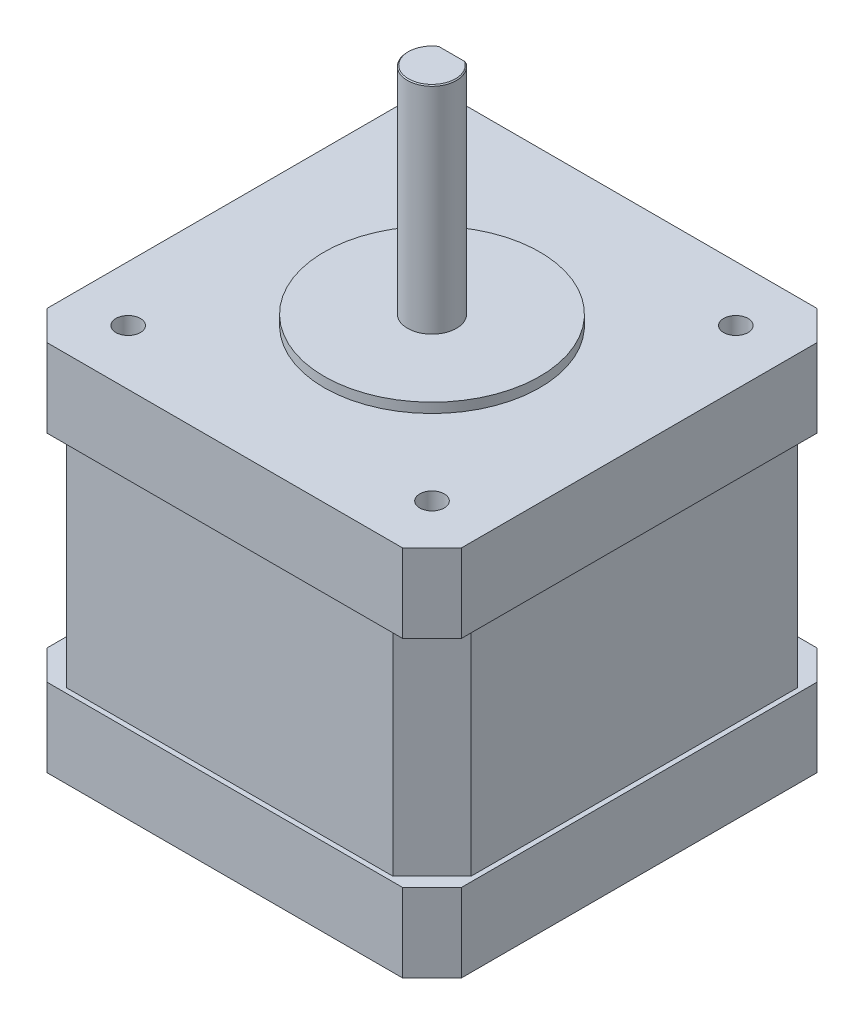
ISO-10303-21;
HEADER;
FILE_DESCRIPTION(('STEP AP214'),'2;1');
FILE_NAME('part.step','',(''),(''),'','','');
FILE_SCHEMA(('AUTOMOTIVE_DESIGN { 1 0 10303 214 1 1 1 1 }'));
ENDSEC;
DATA;
#1=APPLICATION_CONTEXT('core data for automotive mechanical design processes');
#2=APPLICATION_PROTOCOL_DEFINITION('international standard','automotive_design',2000,#1);
#3=PRODUCT_CONTEXT('',#1,'mechanical');
#4=PRODUCT('Part','Part','',(#3));
#5=PRODUCT_RELATED_PRODUCT_CATEGORY('part','',(#4));
#6=PRODUCT_DEFINITION_FORMATION('','',#4);
#7=PRODUCT_DEFINITION_CONTEXT('part definition',#1,'design');
#8=PRODUCT_DEFINITION('design','',#6,#7);
#9=PRODUCT_DEFINITION_SHAPE('','',#8);
#10=(LENGTH_UNIT() NAMED_UNIT(*) SI_UNIT(.MILLI.,.METRE.));
#11=(NAMED_UNIT(*) PLANE_ANGLE_UNIT() SI_UNIT($,.RADIAN.));
#12=(NAMED_UNIT(*) SI_UNIT($,.STERADIAN.) SOLID_ANGLE_UNIT());
#13=UNCERTAINTY_MEASURE_WITH_UNIT(LENGTH_MEASURE(1.E-05),#10,'distance_accuracy_value','');
#14=(GEOMETRIC_REPRESENTATION_CONTEXT(3) GLOBAL_UNCERTAINTY_ASSIGNED_CONTEXT((#13)) GLOBAL_UNIT_ASSIGNED_CONTEXT((#10,
#11,#12)) REPRESENTATION_CONTEXT('',''));
#15=CARTESIAN_POINT('',(0.,0.,0.));
#16=DIRECTION('',(0.,0.,1.));
#17=DIRECTION('',(1.,0.,0.));
#18=AXIS2_PLACEMENT_3D('',#15,#16,#17);
#19=CARTESIAN_POINT('',(-21.15,0.928932188134522,-16.15));
#20=DIRECTION('',(0.707106781186547,0.,0.707106781186548));
#21=DIRECTION('',(0.707106781186548,0.,-0.707106781186547));
#22=AXIS2_PLACEMENT_3D('',#19,#20,#21);
#23=PLANE('',#22);
#24=DIRECTION('',(0.,1.,0.));
#25=VECTOR('',#24,1.);
#26=CARTESIAN_POINT('',(-16.6499999999999,0.928932188134522,-20.6500000000001));
#27=LINE('',#26,#25);
#28=CARTESIAN_POINT('',(-16.6499999999999,7.99999969954202,-20.6500000000001));
#29=VERTEX_POINT('',#28);
#30=CARTESIAN_POINT('',(-16.6499999999999,30.,-20.6500000000001));
#31=VERTEX_POINT('',#30);
#32=EDGE_CURVE('E566',#29,#31,#27,.T.);
#33=ORIENTED_EDGE('',*,*,#32,.F.);
#34=DIRECTION('',(-0.707106781186548,0.,0.707106781186547));
#35=VECTOR('',#34,1.);
#36=CARTESIAN_POINT('',(-21.15,8.,-16.15));
#37=LINE('',#36,#35);
#38=CARTESIAN_POINT('',(-20.65,7.99999969954202,-16.65));
#39=VERTEX_POINT('',#38);
#40=EDGE_CURVE('E275',#29,#39,#37,.T.);
#41=ORIENTED_EDGE('',*,*,#40,.T.);
#42=DIRECTION('',(0.,-1.,0.));
#43=VECTOR('',#42,1.);
#44=CARTESIAN_POINT('',(-20.65,0.928932188134522,-16.65));
#45=LINE('',#44,#43);
#46=CARTESIAN_POINT('',(-20.65,30.,-16.65));
#47=VERTEX_POINT('',#46);
#48=EDGE_CURVE('E576',#47,#39,#45,.T.);
#49=ORIENTED_EDGE('',*,*,#48,.F.);
#50=DIRECTION('',(0.707106781186548,0.,-0.707106781186547));
#51=VECTOR('',#50,1.);
#52=CARTESIAN_POINT('',(-21.15,30.,-16.15));
#53=LINE('',#52,#51);
#54=EDGE_CURVE('E278',#47,#31,#53,.T.);
#55=ORIENTED_EDGE('',*,*,#54,.T.);
#56=EDGE_LOOP('',(#33,#41,#49,#55));
#57=FACE_BOUND('',#56,.T.);
#58=ADVANCED_FACE('F47',(#57),#23,.F.);
#59=CARTESIAN_POINT('',(-18.65,8.00000000000001,18.65));
#60=DIRECTION('',(0.707106781186548,0.,-0.707106781186548));
#61=DIRECTION('',(-0.707106781186548,0.,-0.707106781186548));
#62=AXIS2_PLACEMENT_3D('',#59,#60,#61);
#63=PLANE('',#62);
#64=DIRECTION('',(0.,-1.,0.));
#65=VECTOR('',#64,1.);
#66=CARTESIAN_POINT('',(-16.6500000000002,8.00000000000001,20.6499999999998));
#67=LINE('',#66,#65);
#68=CARTESIAN_POINT('',(-16.6500000000002,30.,20.6499999999998));
#69=VERTEX_POINT('',#68);
#70=CARTESIAN_POINT('',(-16.6500000000002,7.99999969954202,20.6499999999998));
#71=VERTEX_POINT('',#70);
#72=EDGE_CURVE('E236',#69,#71,#67,.T.);
#73=ORIENTED_EDGE('',*,*,#72,.F.);
#74=DIRECTION('',(-0.707106781186548,0.,-0.707106781186548));
#75=VECTOR('',#74,1.);
#76=CARTESIAN_POINT('',(-18.65,30.,18.65));
#77=LINE('',#76,#75);
#78=CARTESIAN_POINT('',(-20.65,30.,16.65));
#79=VERTEX_POINT('',#78);
#80=EDGE_CURVE('E248',#69,#79,#77,.T.);
#81=ORIENTED_EDGE('',*,*,#80,.T.);
#82=DIRECTION('',(0.,1.,0.));
#83=VECTOR('',#82,1.);
#84=CARTESIAN_POINT('',(-20.65,8.00000000000001,16.65));
#85=LINE('',#84,#83);
#86=CARTESIAN_POINT('',(-20.65,8.00000000000001,16.65));
#87=VERTEX_POINT('',#86);
#88=EDGE_CURVE('E573',#87,#79,#85,.T.);
#89=ORIENTED_EDGE('',*,*,#88,.F.);
#90=DIRECTION('',(-0.707106781186548,0.,-0.707106781186548));
#91=VECTOR('',#90,1.);
#92=CARTESIAN_POINT('',(-18.65,8.00000000000001,18.65));
#93=LINE('',#92,#91);
#94=EDGE_CURVE('E279',#71,#87,#93,.T.);
#95=ORIENTED_EDGE('',*,*,#94,.F.);
#96=EDGE_LOOP('',(#73,#81,#89,#95));
#97=FACE_BOUND('',#96,.T.);
#98=ADVANCED_FACE('F427',(#97),#63,.F.);
#99=CARTESIAN_POINT('',(-21.15,8.,-21.15));
#100=DIRECTION('',(0.,0.,1.));
#101=DIRECTION('',(1.,0.,0.));
#102=AXIS2_PLACEMENT_3D('',#99,#100,#101);
#103=PLANE('',#102);
#104=DIRECTION('',(0.,-1.,0.));
#105=VECTOR('',#104,1.);
#106=CARTESIAN_POINT('',(18.15,38.,-21.15));
#107=LINE('',#106,#105);
#108=CARTESIAN_POINT('',(18.15,38.,-21.15));
#109=VERTEX_POINT('',#108);
#110=CARTESIAN_POINT('',(18.15,30.,-21.15));
#111=VERTEX_POINT('',#110);
#112=EDGE_CURVE('E320',#109,#111,#107,.T.);
#113=ORIENTED_EDGE('',*,*,#112,.T.);
#114=DIRECTION('',(-1.,0.,0.));
#115=VECTOR('',#114,1.);
#116=CARTESIAN_POINT('',(-16.15,30.,-21.15));
#117=LINE('',#116,#115);
#118=CARTESIAN_POINT('',(-18.15,30.,-21.15));
#119=VERTEX_POINT('',#118);
#120=EDGE_CURVE('E272',#111,#119,#117,.T.);
#121=ORIENTED_EDGE('',*,*,#120,.T.);
#122=DIRECTION('',(0.,-1.,0.));
#123=VECTOR('',#122,1.);
#124=CARTESIAN_POINT('',(-18.15,38.,-21.15));
#125=LINE('',#124,#123);
#126=CARTESIAN_POINT('',(-18.15,38.,-21.15));
#127=VERTEX_POINT('',#126);
#128=EDGE_CURVE('E317',#127,#119,#125,.T.);
#129=ORIENTED_EDGE('',*,*,#128,.F.);
#130=DIRECTION('',(-1.,0.,0.));
#131=VECTOR('',#130,1.);
#132=CARTESIAN_POINT('',(18.15,38.,-21.15));
#133=LINE('',#132,#131);
#134=EDGE_CURVE('E298',#109,#127,#133,.T.);
#135=ORIENTED_EDGE('',*,*,#134,.F.);
#136=EDGE_LOOP('',(#113,#121,#129,#135));
#137=FACE_BOUND('',#136,.T.);
#138=ADVANCED_FACE('F430',(#137),#103,.F.);
#139=CARTESIAN_POINT('',(21.15,8.,-21.15));
#140=DIRECTION('',(-1.,0.,0.));
#141=DIRECTION('',(0.,0.,1.));
#142=AXIS2_PLACEMENT_3D('',#139,#140,#141);
#143=PLANE('',#142);
#144=DIRECTION('',(0.,0.,-1.));
#145=VECTOR('',#144,1.);
#146=CARTESIAN_POINT('',(21.15,30.,0.));
#147=LINE('',#146,#145);
#148=CARTESIAN_POINT('',(21.15,30.,18.15));
#149=VERTEX_POINT('',#148);
#150=CARTESIAN_POINT('',(21.15,30.,-18.15));
#151=VERTEX_POINT('',#150);
#152=EDGE_CURVE('E255',#149,#151,#147,.T.);
#153=ORIENTED_EDGE('',*,*,#152,.T.);
#154=DIRECTION('',(0.,-1.,0.));
#155=VECTOR('',#154,1.);
#156=CARTESIAN_POINT('',(21.15,38.,-18.15));
#157=LINE('',#156,#155);
#158=CARTESIAN_POINT('',(21.15,38.,-18.15));
#159=VERTEX_POINT('',#158);
#160=EDGE_CURVE('E323',#159,#151,#157,.T.);
#161=ORIENTED_EDGE('',*,*,#160,.F.);
#162=DIRECTION('',(0.,0.,-1.));
#163=VECTOR('',#162,1.);
#164=CARTESIAN_POINT('',(21.15,38.,18.15));
#165=LINE('',#164,#163);
#166=CARTESIAN_POINT('',(21.15,38.,18.15));
#167=VERTEX_POINT('',#166);
#168=EDGE_CURVE('E294',#167,#159,#165,.T.);
#169=ORIENTED_EDGE('',*,*,#168,.F.);
#170=DIRECTION('',(0.,-1.,0.));
#171=VECTOR('',#170,1.);
#172=CARTESIAN_POINT('',(21.15,38.,18.15));
#173=LINE('',#172,#171);
#174=EDGE_CURVE('E326',#167,#149,#173,.T.);
#175=ORIENTED_EDGE('',*,*,#174,.T.);
#176=EDGE_LOOP('',(#153,#161,#169,#175));
#177=FACE_BOUND('',#176,.T.);
#178=ADVANCED_FACE('F490',(#177),#143,.F.);
#179=CARTESIAN_POINT('',(-21.15,8.,21.15));
#180=DIRECTION('',(0.,0.,-1.));
#181=DIRECTION('',(-1.,0.,0.));
#182=AXIS2_PLACEMENT_3D('',#179,#180,#181);
#183=PLANE('',#182);
#184=DIRECTION('',(1.,0.,0.));
#185=VECTOR('',#184,1.);
#186=CARTESIAN_POINT('',(0.,30.,21.15));
#187=LINE('',#186,#185);
#188=CARTESIAN_POINT('',(-18.15,30.,21.15));
#189=VERTEX_POINT('',#188);
#190=CARTESIAN_POINT('',(18.15,30.,21.15));
#191=VERTEX_POINT('',#190);
#192=EDGE_CURVE('E540',#189,#191,#187,.T.);
#193=ORIENTED_EDGE('',*,*,#192,.T.);
#194=DIRECTION('',(0.,-1.,0.));
#195=VECTOR('',#194,1.);
#196=CARTESIAN_POINT('',(18.15,38.,21.15));
#197=LINE('',#196,#195);
#198=CARTESIAN_POINT('',(18.15,38.,21.15));
#199=VERTEX_POINT('',#198);
#200=EDGE_CURVE('E329',#199,#191,#197,.T.);
#201=ORIENTED_EDGE('',*,*,#200,.F.);
#202=DIRECTION('',(1.,0.,0.));
#203=VECTOR('',#202,1.);
#204=CARTESIAN_POINT('',(-18.15,38.,21.15));
#205=LINE('',#204,#203);
#206=CARTESIAN_POINT('',(-18.15,38.,21.15));
#207=VERTEX_POINT('',#206);
#208=EDGE_CURVE('E289',#207,#199,#205,.T.);
#209=ORIENTED_EDGE('',*,*,#208,.F.);
#210=DIRECTION('',(0.,-1.,0.));
#211=VECTOR('',#210,1.);
#212=CARTESIAN_POINT('',(-18.15,38.,21.15));
#213=LINE('',#212,#211);
#214=EDGE_CURVE('E332',#207,#189,#213,.T.);
#215=ORIENTED_EDGE('',*,*,#214,.T.);
#216=EDGE_LOOP('',(#193,#201,#209,#215));
#217=FACE_BOUND('',#216,.T.);
#218=ADVANCED_FACE('F438',(#217),#183,.F.);
#219=CARTESIAN_POINT('',(18.65,8.00000000000001,-18.65));
#220=DIRECTION('',(-0.707106781186546,0.,0.707106781186549));
#221=DIRECTION('',(0.707106781186549,0.,0.707106781186546));
#222=AXIS2_PLACEMENT_3D('',#219,#220,#221);
#223=PLANE('',#222);
#224=DIRECTION('',(0.,-1.,0.));
#225=VECTOR('',#224,1.);
#226=CARTESIAN_POINT('',(16.65,8.00000000000001,-20.6499999999999));
#227=LINE('',#226,#225);
#228=CARTESIAN_POINT('',(16.65,30.,-20.6499999999999));
#229=VERTEX_POINT('',#228);
#230=CARTESIAN_POINT('',(16.65,8.00000000000001,-20.6499999999999));
#231=VERTEX_POINT('',#230);
#232=EDGE_CURVE('E563',#229,#231,#227,.T.);
#233=ORIENTED_EDGE('',*,*,#232,.F.);
#234=DIRECTION('',(0.707106781186549,0.,0.707106781186546));
#235=VECTOR('',#234,1.);
#236=CARTESIAN_POINT('',(18.65,30.,-18.65));
#237=LINE('',#236,#235);
#238=CARTESIAN_POINT('',(20.65,30.,-16.65));
#239=VERTEX_POINT('',#238);
#240=EDGE_CURVE('E265',#229,#239,#237,.T.);
#241=ORIENTED_EDGE('',*,*,#240,.T.);
#242=DIRECTION('',(0.,1.,0.));
#243=VECTOR('',#242,1.);
#244=CARTESIAN_POINT('',(20.65,8.00000000000001,-16.65));
#245=LINE('',#244,#243);
#246=CARTESIAN_POINT('',(20.65,7.99999969954202,-16.65));
#247=VERTEX_POINT('',#246);
#248=EDGE_CURVE('E561',#247,#239,#245,.T.);
#249=ORIENTED_EDGE('',*,*,#248,.F.);
#250=DIRECTION('',(0.707106781186549,0.,0.707106781186546));
#251=VECTOR('',#250,1.);
#252=CARTESIAN_POINT('',(18.65,8.00000000000001,-18.65));
#253=LINE('',#252,#251);
#254=EDGE_CURVE('E259',#231,#247,#253,.T.);
#255=ORIENTED_EDGE('',*,*,#254,.F.);
#256=EDGE_LOOP('',(#233,#241,#249,#255));
#257=FACE_BOUND('',#256,.T.);
#258=ADVANCED_FACE('F435',(#257),#223,.F.);
#259=CARTESIAN_POINT('',(18.65,8.00000000000001,18.65));
#260=DIRECTION('',(0.707106781186549,0.,0.707106781186546));
#261=DIRECTION('',(0.707106781186546,0.,-0.707106781186549));
#262=AXIS2_PLACEMENT_3D('',#259,#260,#261);
#263=PLANE('',#262);
#264=DIRECTION('',(0.707106781186546,0.,-0.707106781186549));
#265=VECTOR('',#264,1.);
#266=CARTESIAN_POINT('',(18.65,8.00000000000001,18.65));
#267=LINE('',#266,#265);
#268=CARTESIAN_POINT('',(16.6499999999998,8.00000000000001,20.6500000000002));
#269=VERTEX_POINT('',#268);
#270=CARTESIAN_POINT('',(20.65,7.99999969954202,16.65));
#271=VERTEX_POINT('',#270);
#272=EDGE_CURVE('E257',#269,#271,#267,.T.);
#273=ORIENTED_EDGE('',*,*,#272,.T.);
#274=DIRECTION('',(0.,1.,0.));
#275=VECTOR('',#274,1.);
#276=CARTESIAN_POINT('',(20.65,8.00000000000001,16.65));
#277=LINE('',#276,#275);
#278=CARTESIAN_POINT('',(20.65,30.,16.65));
#279=VERTEX_POINT('',#278);
#280=EDGE_CURVE('E253',#271,#279,#277,.T.);
#281=ORIENTED_EDGE('',*,*,#280,.T.);
#282=DIRECTION('',(0.707106781186546,0.,-0.707106781186549));
#283=VECTOR('',#282,1.);
#284=CARTESIAN_POINT('',(18.65,30.,18.65));
#285=LINE('',#284,#283);
#286=CARTESIAN_POINT('',(16.6499999999998,30.,20.6500000000002));
#287=VERTEX_POINT('',#286);
#288=EDGE_CURVE('E246',#287,#279,#285,.T.);
#289=ORIENTED_EDGE('',*,*,#288,.F.);
#290=DIRECTION('',(0.,-1.,0.));
#291=VECTOR('',#290,1.);
#292=CARTESIAN_POINT('',(16.6499999999998,8.00000000000001,20.6500000000002));
#293=LINE('',#292,#291);
#294=EDGE_CURVE('E225',#287,#269,#293,.T.);
#295=ORIENTED_EDGE('',*,*,#294,.T.);
#296=EDGE_LOOP('',(#273,#281,#289,#295));
#297=FACE_BOUND('',#296,.T.);
#298=ADVANCED_FACE('F252',(#297),#263,.T.);
#299=CARTESIAN_POINT('',(-21.15,8.,-21.15));
#300=DIRECTION('',(1.,0.,0.));
#301=DIRECTION('',(0.,0.,-1.));
#302=AXIS2_PLACEMENT_3D('',#299,#300,#301);
#303=PLANE('',#302);
#304=DIRECTION('',(0.,0.,1.));
#305=VECTOR('',#304,1.);
#306=CARTESIAN_POINT('',(-21.15,30.,-21.15));
#307=LINE('',#306,#305);
#308=CARTESIAN_POINT('',(-21.15,30.,-18.15));
#309=VERTEX_POINT('',#308);
#310=CARTESIAN_POINT('',(-21.15,30.,18.15));
#311=VERTEX_POINT('',#310);
#312=EDGE_CURVE('E276',#309,#311,#307,.T.);
#313=ORIENTED_EDGE('',*,*,#312,.T.);
#314=DIRECTION('',(0.,-1.,0.));
#315=VECTOR('',#314,1.);
#316=CARTESIAN_POINT('',(-21.15,38.,18.15));
#317=LINE('',#316,#315);
#318=CARTESIAN_POINT('',(-21.15,38.,18.15));
#319=VERTEX_POINT('',#318);
#320=EDGE_CURVE('E304',#319,#311,#317,.T.);
#321=ORIENTED_EDGE('',*,*,#320,.F.);
#322=DIRECTION('',(0.,0.,1.));
#323=VECTOR('',#322,1.);
#324=CARTESIAN_POINT('',(-21.15,38.,-18.15));
#325=LINE('',#324,#323);
#326=CARTESIAN_POINT('',(-21.15,38.,-18.15));
#327=VERTEX_POINT('',#326);
#328=EDGE_CURVE('E302',#327,#319,#325,.T.);
#329=ORIENTED_EDGE('',*,*,#328,.F.);
#330=DIRECTION('',(0.,-1.,0.));
#331=VECTOR('',#330,1.);
#332=CARTESIAN_POINT('',(-21.15,38.,-18.15));
#333=LINE('',#332,#331);
#334=EDGE_CURVE('E314',#327,#309,#333,.T.);
#335=ORIENTED_EDGE('',*,*,#334,.T.);
#336=EDGE_LOOP('',(#313,#321,#329,#335));
#337=FACE_BOUND('',#336,.T.);
#338=ADVANCED_FACE('F434',(#337),#303,.F.);
#339=DIRECTION('',(1.,0.,0.));
#340=VECTOR('',#339,1.);
#341=CARTESIAN_POINT('',(-16.15,8.,-21.15));
#342=LINE('',#341,#340);
#343=CARTESIAN_POINT('',(-18.15,8.,-21.15));
#344=VERTEX_POINT('',#343);
#345=CARTESIAN_POINT('',(18.15,8.00000000000001,-21.15));
#346=VERTEX_POINT('',#345);
#347=EDGE_CURVE('E269',#344,#346,#342,.T.);
#348=ORIENTED_EDGE('',*,*,#347,.T.);
#349=DIRECTION('',(0.,-1.,0.));
#350=VECTOR('',#349,1.);
#351=CARTESIAN_POINT('',(18.15,8.,-21.15));
#352=LINE('',#351,#350);
#353=CARTESIAN_POINT('',(18.15,0.,-21.15));
#354=VERTEX_POINT('',#353);
#355=EDGE_CURVE('E361',#346,#354,#352,.T.);
#356=ORIENTED_EDGE('',*,*,#355,.T.);
#357=DIRECTION('',(-1.,0.,0.));
#358=VECTOR('',#357,1.);
#359=CARTESIAN_POINT('',(-21.15,0.,-21.15));
#360=LINE('',#359,#358);
#361=CARTESIAN_POINT('',(-18.15,0.,-21.15));
#362=VERTEX_POINT('',#361);
#363=EDGE_CURVE('E338',#354,#362,#360,.T.);
#364=ORIENTED_EDGE('',*,*,#363,.T.);
#365=DIRECTION('',(0.,1.,0.));
#366=VECTOR('',#365,1.);
#367=CARTESIAN_POINT('',(-18.15,8.,-21.15));
#368=LINE('',#367,#366);
#369=EDGE_CURVE('E364',#362,#344,#368,.T.);
#370=ORIENTED_EDGE('',*,*,#369,.T.);
#371=EDGE_LOOP('',(#348,#356,#364,#370));
#372=FACE_BOUND('',#371,.T.);
#373=ADVANCED_FACE('F482',(#372),#103,.F.);
#374=DIRECTION('',(0.,1.,0.));
#375=VECTOR('',#374,1.);
#376=CARTESIAN_POINT('',(-21.15,8.,18.15));
#377=LINE('',#376,#375);
#378=CARTESIAN_POINT('',(-21.15,0.,18.15));
#379=VERTEX_POINT('',#378);
#380=CARTESIAN_POINT('',(-21.15,8.00000000000001,18.15));
#381=VERTEX_POINT('',#380);
#382=EDGE_CURVE('E347',#379,#381,#377,.T.);
#383=ORIENTED_EDGE('',*,*,#382,.T.);
#384=DIRECTION('',(0.,0.,-1.));
#385=VECTOR('',#384,1.);
#386=CARTESIAN_POINT('',(-21.15,8.,-21.15));
#387=LINE('',#386,#385);
#388=CARTESIAN_POINT('',(-21.15,8.,-18.15));
#389=VERTEX_POINT('',#388);
#390=EDGE_CURVE('E271',#381,#389,#387,.T.);
#391=ORIENTED_EDGE('',*,*,#390,.T.);
#392=DIRECTION('',(0.,-1.,0.));
#393=VECTOR('',#392,1.);
#394=CARTESIAN_POINT('',(-21.15,8.,-18.15));
#395=LINE('',#394,#393);
#396=CARTESIAN_POINT('',(-21.15,0.,-18.15));
#397=VERTEX_POINT('',#396);
#398=EDGE_CURVE('E350',#389,#397,#395,.T.);
#399=ORIENTED_EDGE('',*,*,#398,.T.);
#400=DIRECTION('',(0.,0.,1.));
#401=VECTOR('',#400,1.);
#402=CARTESIAN_POINT('',(-21.15,0.,-21.15));
#403=LINE('',#402,#401);
#404=EDGE_CURVE('E341',#397,#379,#403,.T.);
#405=ORIENTED_EDGE('',*,*,#404,.T.);
#406=EDGE_LOOP('',(#383,#391,#399,#405));
#407=FACE_BOUND('',#406,.T.);
#408=ADVANCED_FACE('F479',(#407),#303,.F.);
#409=DIRECTION('',(0.,1.,0.));
#410=VECTOR('',#409,1.);
#411=CARTESIAN_POINT('',(21.15,8.,-18.15));
#412=LINE('',#411,#410);
#413=CARTESIAN_POINT('',(21.15,0.,-18.15));
#414=VERTEX_POINT('',#413);
#415=CARTESIAN_POINT('',(21.15,8.00000000000001,-18.15));
#416=VERTEX_POINT('',#415);
#417=EDGE_CURVE('E379',#414,#416,#412,.T.);
#418=ORIENTED_EDGE('',*,*,#417,.T.);
#419=DIRECTION('',(0.,0.,-1.));
#420=VECTOR('',#419,1.);
#421=CARTESIAN_POINT('',(21.15,8.00000000000001,0.));
#422=LINE('',#421,#420);
#423=CARTESIAN_POINT('',(21.15,8.00000000000001,18.15));
#424=VERTEX_POINT('',#423);
#425=EDGE_CURVE('E254',#424,#416,#422,.T.);
#426=ORIENTED_EDGE('',*,*,#425,.F.);
#427=DIRECTION('',(0.,-1.,0.));
#428=VECTOR('',#427,1.);
#429=CARTESIAN_POINT('',(21.15,8.,18.15));
#430=LINE('',#429,#428);
#431=CARTESIAN_POINT('',(21.15,0.,18.15));
#432=VERTEX_POINT('',#431);
#433=EDGE_CURVE('E376',#424,#432,#430,.T.);
#434=ORIENTED_EDGE('',*,*,#433,.T.);
#435=DIRECTION('',(0.,0.,-1.));
#436=VECTOR('',#435,1.);
#437=CARTESIAN_POINT('',(21.15,0.,-21.15));
#438=LINE('',#437,#436);
#439=EDGE_CURVE('E335',#432,#414,#438,.T.);
#440=ORIENTED_EDGE('',*,*,#439,.T.);
#441=EDGE_LOOP('',(#418,#426,#434,#440));
#442=FACE_BOUND('',#441,.T.);
#443=ADVANCED_FACE('F477',(#442),#143,.F.);
#444=DIRECTION('',(0.,1.,0.));
#445=VECTOR('',#444,1.);
#446=CARTESIAN_POINT('',(18.15,8.,21.15));
#447=LINE('',#446,#445);
#448=CARTESIAN_POINT('',(18.15,0.,21.15));
#449=VERTEX_POINT('',#448);
#450=CARTESIAN_POINT('',(18.15,8.00000000000001,21.15));
#451=VERTEX_POINT('',#450);
#452=EDGE_CURVE('E382',#449,#451,#447,.T.);
#453=ORIENTED_EDGE('',*,*,#452,.T.);
#454=DIRECTION('',(1.,0.,0.));
#455=VECTOR('',#454,1.);
#456=CARTESIAN_POINT('',(0.,8.00000000000001,21.15));
#457=LINE('',#456,#455);
#458=CARTESIAN_POINT('',(-18.15,8.00000000000001,21.15));
#459=VERTEX_POINT('',#458);
#460=EDGE_CURVE('E523',#459,#451,#457,.T.);
#461=ORIENTED_EDGE('',*,*,#460,.F.);
#462=DIRECTION('',(0.,-1.,0.));
#463=VECTOR('',#462,1.);
#464=CARTESIAN_POINT('',(-18.15,8.,21.15));
#465=LINE('',#464,#463);
#466=CARTESIAN_POINT('',(-18.15,0.,21.15));
#467=VERTEX_POINT('',#466);
#468=EDGE_CURVE('E385',#459,#467,#465,.T.);
#469=ORIENTED_EDGE('',*,*,#468,.T.);
#470=DIRECTION('',(1.,0.,0.));
#471=VECTOR('',#470,1.);
#472=CARTESIAN_POINT('',(-21.15,0.,21.15));
#473=LINE('',#472,#471);
#474=EDGE_CURVE('E344',#467,#449,#473,.T.);
#475=ORIENTED_EDGE('',*,*,#474,.T.);
#476=EDGE_LOOP('',(#453,#461,#469,#475));
#477=FACE_BOUND('',#476,.T.);
#478=ADVANCED_FACE('F473',(#477),#183,.F.);
#479=CARTESIAN_POINT('',(0.,0.,0.));
#480=DIRECTION('',(0.,1.,0.));
#481=DIRECTION('',(0.,0.,1.));
#482=AXIS2_PLACEMENT_3D('',#479,#480,#481);
#483=PLANE('',#482);
#484=CARTESIAN_POINT('',(-15.5,0.,-15.5));
#485=DIRECTION('',(0.,1.,0.));
#486=DIRECTION('',(0.,0.,1.));
#487=AXIS2_PLACEMENT_3D('',#484,#485,#486);
#488=CIRCLE('',#487,1.24999999999998);
#489=CARTESIAN_POINT('',(-15.5,0.,-14.25));
#490=VERTEX_POINT('',#489);
#491=EDGE_CURVE('E582',#490,#490,#488,.T.);
#492=ORIENTED_EDGE('',*,*,#491,.T.);
#493=EDGE_LOOP('',(#492));
#494=FACE_BOUND('',#493,.T.);
#495=CARTESIAN_POINT('',(15.5,0.,-15.5));
#496=DIRECTION('',(0.,1.,0.));
#497=DIRECTION('',(0.,0.,1.));
#498=AXIS2_PLACEMENT_3D('',#495,#496,#497);
#499=CIRCLE('',#498,1.24999999999998);
#500=CARTESIAN_POINT('',(15.5,0.,-14.25));
#501=VERTEX_POINT('',#500);
#502=EDGE_CURVE('E588',#501,#501,#499,.T.);
#503=ORIENTED_EDGE('',*,*,#502,.T.);
#504=EDGE_LOOP('',(#503));
#505=FACE_BOUND('',#504,.T.);
#506=CARTESIAN_POINT('',(15.5,0.,15.5));
#507=DIRECTION('',(0.,1.,0.));
#508=DIRECTION('',(0.,0.,1.));
#509=AXIS2_PLACEMENT_3D('',#506,#507,#508);
#510=CIRCLE('',#509,1.24999999999998);
#511=CARTESIAN_POINT('',(15.5,0.,16.75));
#512=VERTEX_POINT('',#511);
#513=EDGE_CURVE('E594',#512,#512,#510,.T.);
#514=ORIENTED_EDGE('',*,*,#513,.T.);
#515=EDGE_LOOP('',(#514));
#516=FACE_BOUND('',#515,.T.);
#517=CARTESIAN_POINT('',(-15.5,0.,15.5));
#518=DIRECTION('',(0.,1.,0.));
#519=DIRECTION('',(0.,0.,1.));
#520=AXIS2_PLACEMENT_3D('',#517,#518,#519);
#521=CIRCLE('',#520,1.24999999999998);
#522=CARTESIAN_POINT('',(-15.5,0.,16.75));
#523=VERTEX_POINT('',#522);
#524=EDGE_CURVE('E600',#523,#523,#521,.T.);
#525=ORIENTED_EDGE('',*,*,#524,.T.);
#526=EDGE_LOOP('',(#525));
#527=FACE_BOUND('',#526,.T.);
#528=ORIENTED_EDGE('',*,*,#404,.F.);
#529=DIRECTION('',(-0.707106781186549,0.,0.707106781186546));
#530=VECTOR('',#529,1.);
#531=CARTESIAN_POINT('',(-21.15,0.,-18.15));
#532=LINE('',#531,#530);
#533=EDGE_CURVE('E359',#397,#362,#532,.F.);
#534=ORIENTED_EDGE('',*,*,#533,.T.);
#535=ORIENTED_EDGE('',*,*,#363,.F.);
#536=DIRECTION('',(-0.707106781186546,0.,-0.707106781186549));
#537=VECTOR('',#536,1.);
#538=CARTESIAN_POINT('',(18.15,0.,-21.15));
#539=LINE('',#538,#537);
#540=EDGE_CURVE('E357',#354,#414,#539,.F.);
#541=ORIENTED_EDGE('',*,*,#540,.T.);
#542=ORIENTED_EDGE('',*,*,#439,.F.);
#543=DIRECTION('',(0.707106781186548,0.,-0.707106781186547));
#544=VECTOR('',#543,1.);
#545=CARTESIAN_POINT('',(21.15,0.,18.15));
#546=LINE('',#545,#544);
#547=EDGE_CURVE('E353',#432,#449,#546,.F.);
#548=ORIENTED_EDGE('',*,*,#547,.T.);
#549=ORIENTED_EDGE('',*,*,#474,.F.);
#550=DIRECTION('',(0.707106781186546,0.,0.707106781186549));
#551=VECTOR('',#550,1.);
#552=CARTESIAN_POINT('',(-18.15,0.,21.15));
#553=LINE('',#552,#551);
#554=EDGE_CURVE('E355',#467,#379,#553,.F.);
#555=ORIENTED_EDGE('',*,*,#554,.T.);
#556=EDGE_LOOP('',(#528,#534,#535,#541,#542,#548,#549,#555));
#557=FACE_BOUND('',#556,.T.);
#558=ADVANCED_FACE('F469',(#494,#505,#516,#527,#557),#483,.F.);
#559=CARTESIAN_POINT('',(-21.15,8.,-18.15));
#560=DIRECTION('',(0.707106781186546,0.,0.707106781186549));
#561=DIRECTION('',(0.,-1.,0.));
#562=AXIS2_PLACEMENT_3D('',#559,#560,#561);
#563=PLANE('',#562);
#564=DIRECTION('',(0.707106781186549,0.,-0.707106781186546));
#565=VECTOR('',#564,1.);
#566=CARTESIAN_POINT('',(-19.65,8.,-19.65));
#567=LINE('',#566,#565);
#568=EDGE_CURVE('E374',#344,#389,#567,.F.);
#569=ORIENTED_EDGE('',*,*,#568,.F.);
#570=ORIENTED_EDGE('',*,*,#369,.F.);
#571=ORIENTED_EDGE('',*,*,#533,.F.);
#572=ORIENTED_EDGE('',*,*,#398,.F.);
#573=EDGE_LOOP('',(#569,#570,#571,#572));
#574=FACE_BOUND('',#573,.T.);
#575=ADVANCED_FACE('F472',(#574),#563,.F.);
#576=CARTESIAN_POINT('',(18.15,8.,-21.15));
#577=DIRECTION('',(-0.707106781186549,0.,0.707106781186546));
#578=DIRECTION('',(0.,-1.,0.));
#579=AXIS2_PLACEMENT_3D('',#576,#577,#578);
#580=PLANE('',#579);
#581=DIRECTION('',(0.707106781186546,0.,0.707106781186549));
#582=VECTOR('',#581,1.);
#583=CARTESIAN_POINT('',(19.65,8.,-19.6499999999999));
#584=LINE('',#583,#582);
#585=EDGE_CURVE('E371',#416,#346,#584,.F.);
#586=ORIENTED_EDGE('',*,*,#585,.F.);
#587=ORIENTED_EDGE('',*,*,#417,.F.);
#588=ORIENTED_EDGE('',*,*,#540,.F.);
#589=ORIENTED_EDGE('',*,*,#355,.F.);
#590=EDGE_LOOP('',(#586,#587,#588,#589));
#591=FACE_BOUND('',#590,.T.);
#592=ADVANCED_FACE('F497',(#591),#580,.F.);
#593=CARTESIAN_POINT('',(-18.15,8.,21.15));
#594=DIRECTION('',(0.707106781186549,0.,-0.707106781186546));
#595=DIRECTION('',(0.,-1.,0.));
#596=AXIS2_PLACEMENT_3D('',#593,#594,#595);
#597=PLANE('',#596);
#598=DIRECTION('',(-0.707106781186546,0.,-0.707106781186549));
#599=VECTOR('',#598,1.);
#600=CARTESIAN_POINT('',(-19.65,8.,19.65));
#601=LINE('',#600,#599);
#602=EDGE_CURVE('E369',#381,#459,#601,.F.);
#603=ORIENTED_EDGE('',*,*,#602,.F.);
#604=ORIENTED_EDGE('',*,*,#382,.F.);
#605=ORIENTED_EDGE('',*,*,#554,.F.);
#606=ORIENTED_EDGE('',*,*,#468,.F.);
#607=EDGE_LOOP('',(#603,#604,#605,#606));
#608=FACE_BOUND('',#607,.T.);
#609=ADVANCED_FACE('F504',(#608),#597,.F.);
#610=CARTESIAN_POINT('',(21.15,8.,18.15));
#611=DIRECTION('',(-0.707106781186547,0.,-0.707106781186548));
#612=DIRECTION('',(0.,-1.,0.));
#613=AXIS2_PLACEMENT_3D('',#610,#611,#612);
#614=PLANE('',#613);
#615=DIRECTION('',(-0.707106781186548,0.,0.707106781186547));
#616=VECTOR('',#615,1.);
#617=CARTESIAN_POINT('',(19.65,8.,19.65));
#618=LINE('',#617,#616);
#619=EDGE_CURVE('E367',#451,#424,#618,.F.);
#620=ORIENTED_EDGE('',*,*,#619,.F.);
#621=ORIENTED_EDGE('',*,*,#452,.F.);
#622=ORIENTED_EDGE('',*,*,#547,.F.);
#623=ORIENTED_EDGE('',*,*,#433,.F.);
#624=EDGE_LOOP('',(#620,#621,#622,#623));
#625=FACE_BOUND('',#624,.T.);
#626=ADVANCED_FACE('F467',(#625),#614,.F.);
#627=CARTESIAN_POINT('',(-21.15,38.,18.15));
#628=DIRECTION('',(0.707106781186549,0.,-0.707106781186546));
#629=DIRECTION('',(-0.707106781186546,0.,-0.707106781186549));
#630=AXIS2_PLACEMENT_3D('',#627,#628,#629);
#631=PLANE('',#630);
#632=DIRECTION('',(0.707106781186546,0.,0.707106781186549));
#633=VECTOR('',#632,1.);
#634=CARTESIAN_POINT('',(-21.15,30.,18.15));
#635=LINE('',#634,#633);
#636=EDGE_CURVE('E285',#311,#189,#635,.T.);
#637=ORIENTED_EDGE('',*,*,#636,.T.);
#638=ORIENTED_EDGE('',*,*,#214,.F.);
#639=DIRECTION('',(0.707106781186546,0.,0.707106781186549));
#640=VECTOR('',#639,1.);
#641=CARTESIAN_POINT('',(-21.15,38.,18.15));
#642=LINE('',#641,#640);
#643=EDGE_CURVE('E286',#319,#207,#642,.T.);
#644=ORIENTED_EDGE('',*,*,#643,.F.);
#645=ORIENTED_EDGE('',*,*,#320,.T.);
#646=EDGE_LOOP('',(#637,#638,#644,#645));
#647=FACE_BOUND('',#646,.T.);
#648=ADVANCED_FACE('F463',(#647),#631,.F.);
#649=CARTESIAN_POINT('',(18.15,38.,21.15));
#650=DIRECTION('',(-0.707106781186547,0.,-0.707106781186548));
#651=DIRECTION('',(-0.707106781186548,0.,0.707106781186547));
#652=AXIS2_PLACEMENT_3D('',#649,#650,#651);
#653=PLANE('',#652);
#654=DIRECTION('',(0.707106781186548,0.,-0.707106781186547));
#655=VECTOR('',#654,1.);
#656=CARTESIAN_POINT('',(18.15,30.,21.15));
#657=LINE('',#656,#655);
#658=EDGE_CURVE('E306',#191,#149,#657,.T.);
#659=ORIENTED_EDGE('',*,*,#658,.T.);
#660=ORIENTED_EDGE('',*,*,#174,.F.);
#661=DIRECTION('',(0.707106781186548,0.,-0.707106781186547));
#662=VECTOR('',#661,1.);
#663=CARTESIAN_POINT('',(18.15,38.,21.15));
#664=LINE('',#663,#662);
#665=EDGE_CURVE('E292',#199,#167,#664,.T.);
#666=ORIENTED_EDGE('',*,*,#665,.F.);
#667=ORIENTED_EDGE('',*,*,#200,.T.);
#668=EDGE_LOOP('',(#659,#660,#666,#667));
#669=FACE_BOUND('',#668,.T.);
#670=ADVANCED_FACE('F459',(#669),#653,.F.);
#671=CARTESIAN_POINT('',(21.15,38.,-18.15));
#672=DIRECTION('',(-0.707106781186549,0.,0.707106781186546));
#673=DIRECTION('',(0.707106781186546,0.,0.707106781186549));
#674=AXIS2_PLACEMENT_3D('',#671,#672,#673);
#675=PLANE('',#674);
#676=DIRECTION('',(-0.707106781186546,0.,-0.707106781186549));
#677=VECTOR('',#676,1.);
#678=CARTESIAN_POINT('',(21.15,30.,-18.15));
#679=LINE('',#678,#677);
#680=EDGE_CURVE('E308',#151,#111,#679,.T.);
#681=ORIENTED_EDGE('',*,*,#680,.T.);
#682=ORIENTED_EDGE('',*,*,#112,.F.);
#683=DIRECTION('',(-0.707106781186546,0.,-0.707106781186549));
#684=VECTOR('',#683,1.);
#685=CARTESIAN_POINT('',(21.15,38.,-18.15));
#686=LINE('',#685,#684);
#687=EDGE_CURVE('E296',#159,#109,#686,.T.);
#688=ORIENTED_EDGE('',*,*,#687,.F.);
#689=ORIENTED_EDGE('',*,*,#160,.T.);
#690=EDGE_LOOP('',(#681,#682,#688,#689));
#691=FACE_BOUND('',#690,.T.);
#692=ADVANCED_FACE('F455',(#691),#675,.F.);
#693=CARTESIAN_POINT('',(-18.15,38.,-21.15));
#694=DIRECTION('',(0.707106781186546,0.,0.707106781186549));
#695=DIRECTION('',(0.707106781186549,0.,-0.707106781186546));
#696=AXIS2_PLACEMENT_3D('',#693,#694,#695);
#697=PLANE('',#696);
#698=DIRECTION('',(-0.707106781186549,0.,0.707106781186546));
#699=VECTOR('',#698,1.);
#700=CARTESIAN_POINT('',(-18.15,30.,-21.15));
#701=LINE('',#700,#699);
#702=EDGE_CURVE('E290',#119,#309,#701,.T.);
#703=ORIENTED_EDGE('',*,*,#702,.T.);
#704=ORIENTED_EDGE('',*,*,#334,.F.);
#705=DIRECTION('',(-0.707106781186549,0.,0.707106781186546));
#706=VECTOR('',#705,1.);
#707=CARTESIAN_POINT('',(-18.15,38.,-21.15));
#708=LINE('',#707,#706);
#709=EDGE_CURVE('E300',#127,#327,#708,.T.);
#710=ORIENTED_EDGE('',*,*,#709,.F.);
#711=ORIENTED_EDGE('',*,*,#128,.T.);
#712=EDGE_LOOP('',(#703,#704,#710,#711));
#713=FACE_BOUND('',#712,.T.);
#714=ADVANCED_FACE('F451',(#713),#697,.F.);
#715=CARTESIAN_POINT('',(0.,38.,0.));
#716=DIRECTION('',(0.,1.,0.));
#717=DIRECTION('',(0.,0.,1.));
#718=AXIS2_PLACEMENT_3D('',#715,#716,#717);
#719=PLANE('',#718);
#720=CARTESIAN_POINT('',(-15.5,38.,-15.5));
#721=DIRECTION('',(0.,1.,0.));
#722=DIRECTION('',(0.,0.,1.));
#723=AXIS2_PLACEMENT_3D('',#720,#721,#722);
#724=CIRCLE('',#723,1.24999999999999);
#725=CARTESIAN_POINT('',(-15.5,38.,-14.25));
#726=VERTEX_POINT('',#725);
#727=EDGE_CURVE('E579',#726,#726,#724,.T.);
#728=ORIENTED_EDGE('',*,*,#727,.F.);
#729=EDGE_LOOP('',(#728));
#730=FACE_BOUND('',#729,.T.);
#731=CARTESIAN_POINT('',(15.5,38.,-15.5));
#732=DIRECTION('',(0.,1.,0.));
#733=DIRECTION('',(0.,0.,1.));
#734=AXIS2_PLACEMENT_3D('',#731,#732,#733);
#735=CIRCLE('',#734,1.24999999999999);
#736=CARTESIAN_POINT('',(15.5,38.,-14.25));
#737=VERTEX_POINT('',#736);
#738=EDGE_CURVE('E585',#737,#737,#735,.T.);
#739=ORIENTED_EDGE('',*,*,#738,.F.);
#740=EDGE_LOOP('',(#739));
#741=FACE_BOUND('',#740,.T.);
#742=CARTESIAN_POINT('',(15.5,38.,15.5));
#743=DIRECTION('',(0.,1.,0.));
#744=DIRECTION('',(0.,0.,1.));
#745=AXIS2_PLACEMENT_3D('',#742,#743,#744);
#746=CIRCLE('',#745,1.24999999999999);
#747=CARTESIAN_POINT('',(15.5,38.,16.75));
#748=VERTEX_POINT('',#747);
#749=EDGE_CURVE('E591',#748,#748,#746,.T.);
#750=ORIENTED_EDGE('',*,*,#749,.F.);
#751=EDGE_LOOP('',(#750));
#752=FACE_BOUND('',#751,.T.);
#753=CARTESIAN_POINT('',(-15.5,38.,15.5));
#754=DIRECTION('',(0.,1.,0.));
#755=DIRECTION('',(0.,0.,1.));
#756=AXIS2_PLACEMENT_3D('',#753,#754,#755);
#757=CIRCLE('',#756,1.24999999999999);
#758=CARTESIAN_POINT('',(-15.5,38.,16.75));
#759=VERTEX_POINT('',#758);
#760=EDGE_CURVE('E597',#759,#759,#757,.T.);
#761=ORIENTED_EDGE('',*,*,#760,.F.);
#762=EDGE_LOOP('',(#761));
#763=FACE_BOUND('',#762,.T.);
#764=CARTESIAN_POINT('',(0.,38.,0.));
#765=DIRECTION('',(0.,1.,0.));
#766=DIRECTION('',(0.,0.,1.));
#767=AXIS2_PLACEMENT_3D('',#764,#765,#766);
#768=CIRCLE('',#767,11.);
#769=CARTESIAN_POINT('',(0.,38.,11.));
#770=VERTEX_POINT('',#769);
#771=EDGE_CURVE('E388',#770,#770,#768,.T.);
#772=ORIENTED_EDGE('',*,*,#771,.F.);
#773=EDGE_LOOP('',(#772));
#774=FACE_BOUND('',#773,.T.);
#775=ORIENTED_EDGE('',*,*,#643,.T.);
#776=ORIENTED_EDGE('',*,*,#208,.T.);
#777=ORIENTED_EDGE('',*,*,#665,.T.);
#778=ORIENTED_EDGE('',*,*,#168,.T.);
#779=ORIENTED_EDGE('',*,*,#687,.T.);
#780=ORIENTED_EDGE('',*,*,#134,.T.);
#781=ORIENTED_EDGE('',*,*,#709,.T.);
#782=ORIENTED_EDGE('',*,*,#328,.T.);
#783=EDGE_LOOP('',(#775,#776,#777,#778,#779,#780,#781,#782));
#784=FACE_BOUND('',#783,.T.);
#785=ADVANCED_FACE('F445',(#730,#741,#752,#763,#774,#784),#719,.T.);
#786=CARTESIAN_POINT('',(0.,30.,0.));
#787=DIRECTION('',(0.,-1.,0.));
#788=DIRECTION('',(0.,0.,-1.));
#789=AXIS2_PLACEMENT_3D('',#786,#787,#788);
#790=PLANE('',#789);
#791=DIRECTION('',(1.,0.,0.));
#792=VECTOR('',#791,1.);
#793=CARTESIAN_POINT('',(-21.1452214221011,30.,-20.6500000000001));
#794=LINE('',#793,#792);
#795=EDGE_CURVE('E237',#31,#229,#794,.T.);
#796=ORIENTED_EDGE('',*,*,#795,.F.);
#797=ORIENTED_EDGE('',*,*,#54,.F.);
#798=DIRECTION('',(0.,0.,-1.));
#799=VECTOR('',#798,1.);
#800=CARTESIAN_POINT('',(-20.65,30.,21.1452214221012));
#801=LINE('',#800,#799);
#802=EDGE_CURVE('E571',#79,#47,#801,.T.);
#803=ORIENTED_EDGE('',*,*,#802,.F.);
#804=ORIENTED_EDGE('',*,*,#80,.F.);
#805=DIRECTION('',(-1.,0.,0.));
#806=VECTOR('',#805,1.);
#807=CARTESIAN_POINT('',(21.145221422101,30.,20.6500000000002));
#808=LINE('',#807,#806);
#809=EDGE_CURVE('E228',#287,#69,#808,.T.);
#810=ORIENTED_EDGE('',*,*,#809,.F.);
#811=ORIENTED_EDGE('',*,*,#288,.T.);
#812=DIRECTION('',(0.,0.,1.));
#813=VECTOR('',#812,1.);
#814=CARTESIAN_POINT('',(20.65,30.,-21.1452214221012));
#815=LINE('',#814,#813);
#816=EDGE_CURVE('E551',#239,#279,#815,.T.);
#817=ORIENTED_EDGE('',*,*,#816,.F.);
#818=ORIENTED_EDGE('',*,*,#240,.F.);
#819=EDGE_LOOP('',(#796,#797,#803,#804,#810,#811,#817,#818));
#820=FACE_BOUND('',#819,.T.);
#821=ORIENTED_EDGE('',*,*,#192,.F.);
#822=ORIENTED_EDGE('',*,*,#636,.F.);
#823=ORIENTED_EDGE('',*,*,#312,.F.);
#824=ORIENTED_EDGE('',*,*,#702,.F.);
#825=ORIENTED_EDGE('',*,*,#120,.F.);
#826=ORIENTED_EDGE('',*,*,#680,.F.);
#827=ORIENTED_EDGE('',*,*,#152,.F.);
#828=ORIENTED_EDGE('',*,*,#658,.F.);
#829=EDGE_LOOP('',(#821,#822,#823,#824,#825,#826,#827,#828));
#830=FACE_BOUND('',#829,.T.);
#831=ADVANCED_FACE('F243',(#820,#830),#790,.T.);
#832=CARTESIAN_POINT('',(0.,8.,0.));
#833=DIRECTION('',(0.,1.,0.));
#834=DIRECTION('',(0.,0.,1.));
#835=AXIS2_PLACEMENT_3D('',#832,#833,#834);
#836=PLANE('',#835);
#837=ORIENTED_EDGE('',*,*,#40,.F.);
#838=DIRECTION('',(-1.,0.,0.));
#839=VECTOR('',#838,1.);
#840=CARTESIAN_POINT('',(-21.1452214221011,7.99999969954202,-20.6500000000001));
#841=LINE('',#840,#839);
#842=EDGE_CURVE('E553',#231,#29,#841,.T.);
#843=ORIENTED_EDGE('',*,*,#842,.F.);
#844=ORIENTED_EDGE('',*,*,#254,.T.);
#845=DIRECTION('',(0.,0.,-1.));
#846=VECTOR('',#845,1.);
#847=CARTESIAN_POINT('',(20.65,7.99999969954202,-21.1452214221012));
#848=LINE('',#847,#846);
#849=EDGE_CURVE('E249',#271,#247,#848,.T.);
#850=ORIENTED_EDGE('',*,*,#849,.F.);
#851=ORIENTED_EDGE('',*,*,#272,.F.);
#852=DIRECTION('',(1.,0.,0.));
#853=VECTOR('',#852,1.);
#854=CARTESIAN_POINT('',(21.145221422101,7.99999969954202,20.6500000000002));
#855=LINE('',#854,#853);
#856=EDGE_CURVE('E231',#71,#269,#855,.T.);
#857=ORIENTED_EDGE('',*,*,#856,.F.);
#858=ORIENTED_EDGE('',*,*,#94,.T.);
#859=DIRECTION('',(0.,0.,1.));
#860=VECTOR('',#859,1.);
#861=CARTESIAN_POINT('',(-20.65,7.99999969954202,21.1452214221012));
#862=LINE('',#861,#860);
#863=EDGE_CURVE('E568',#39,#87,#862,.T.);
#864=ORIENTED_EDGE('',*,*,#863,.F.);
#865=EDGE_LOOP('',(#837,#843,#844,#850,#851,#857,#858,#864));
#866=FACE_BOUND('',#865,.T.);
#867=ORIENTED_EDGE('',*,*,#460,.T.);
#868=ORIENTED_EDGE('',*,*,#619,.T.);
#869=ORIENTED_EDGE('',*,*,#425,.T.);
#870=ORIENTED_EDGE('',*,*,#585,.T.);
#871=ORIENTED_EDGE('',*,*,#347,.F.);
#872=ORIENTED_EDGE('',*,*,#568,.T.);
#873=ORIENTED_EDGE('',*,*,#390,.F.);
#874=ORIENTED_EDGE('',*,*,#602,.T.);
#875=EDGE_LOOP('',(#867,#868,#869,#870,#871,#872,#873,#874));
#876=FACE_BOUND('',#875,.T.);
#877=ADVANCED_FACE('F425',(#866,#876),#836,.T.);
#878=CARTESIAN_POINT('',(0.,39.,0.));
#879=DIRECTION('',(0.,-1.,0.));
#880=DIRECTION('',(0.,0.,-1.));
#881=AXIS2_PLACEMENT_3D('',#878,#879,#880);
#882=CYLINDRICAL_SURFACE('',#881,11.);
#883=CARTESIAN_POINT('',(0.,39.,0.));
#884=DIRECTION('',(0.,1.,0.));
#885=DIRECTION('',(0.,0.,1.));
#886=AXIS2_PLACEMENT_3D('',#883,#884,#885);
#887=CIRCLE('',#886,11.);
#888=CARTESIAN_POINT('',(0.,39.,11.));
#889=VERTEX_POINT('',#888);
#890=EDGE_CURVE('E268',#889,#889,#887,.T.);
#891=ORIENTED_EDGE('',*,*,#890,.F.);
#892=EDGE_LOOP('',(#891));
#893=FACE_BOUND('',#892,.T.);
#894=ORIENTED_EDGE('',*,*,#771,.T.);
#895=EDGE_LOOP('',(#894));
#896=FACE_BOUND('',#895,.T.);
#897=ADVANCED_FACE('F421',(#893,#896),#882,.T.);
#898=CARTESIAN_POINT('',(0.,39.,0.));
#899=DIRECTION('',(0.,1.,0.));
#900=DIRECTION('',(0.,0.,1.));
#901=AXIS2_PLACEMENT_3D('',#898,#899,#900);
#902=PLANE('',#901);
#903=CARTESIAN_POINT('',(0.,39.,0.));
#904=DIRECTION('',(0.,1.,0.));
#905=DIRECTION('',(0.,0.,1.));
#906=AXIS2_PLACEMENT_3D('',#903,#904,#905);
#907=CIRCLE('',#906,2.5);
#908=CARTESIAN_POINT('',(0.,39.,2.5));
#909=VERTEX_POINT('',#908);
#910=EDGE_CURVE('E393',#909,#909,#907,.T.);
#911=ORIENTED_EDGE('',*,*,#910,.F.);
#912=EDGE_LOOP('',(#911));
#913=FACE_BOUND('',#912,.T.);
#914=ORIENTED_EDGE('',*,*,#890,.T.);
#915=EDGE_LOOP('',(#914));
#916=FACE_BOUND('',#915,.T.);
#917=ADVANCED_FACE('F418',(#913,#916),#902,.T.);
#918=CARTESIAN_POINT('',(0.,61.,0.));
#919=DIRECTION('',(0.,-1.,0.));
#920=DIRECTION('',(0.,0.,-1.));
#921=AXIS2_PLACEMENT_3D('',#918,#919,#920);
#922=CYLINDRICAL_SURFACE('',#921,2.5);
#923=DIRECTION('',(0.,1.,0.));
#924=VECTOR('',#923,1.);
#925=CARTESIAN_POINT('',(1.5,43.,-2.));
#926=LINE('',#925,#924);
#927=CARTESIAN_POINT('',(1.5,43.,-2.));
#928=VERTEX_POINT('',#927);
#929=CARTESIAN_POINT('',(1.5,60.9,-2.));
#930=VERTEX_POINT('',#929);
#931=EDGE_CURVE('E611',#928,#930,#926,.T.);
#932=ORIENTED_EDGE('',*,*,#931,.T.);
#933=CARTESIAN_POINT('',(0.,60.9,0.));
#934=DIRECTION('',(0.,1.,0.));
#935=DIRECTION('',(0.,0.,1.));
#936=AXIS2_PLACEMENT_3D('',#933,#934,#935);
#937=CIRCLE('',#936,2.5);
#938=CARTESIAN_POINT('',(-1.5,60.9,-2.));
#939=VERTEX_POINT('',#938);
#940=EDGE_CURVE('E11',#930,#939,#937,.F.);
#941=ORIENTED_EDGE('',*,*,#940,.T.);
#942=DIRECTION('',(0.,1.,0.));
#943=VECTOR('',#942,1.);
#944=CARTESIAN_POINT('',(-1.5,43.,-2.));
#945=LINE('',#944,#943);
#946=CARTESIAN_POINT('',(-1.5,43.,-2.));
#947=VERTEX_POINT('',#946);
#948=EDGE_CURVE('E609',#947,#939,#945,.T.);
#949=ORIENTED_EDGE('',*,*,#948,.F.);
#950=CARTESIAN_POINT('',(0.,43.,0.));
#951=DIRECTION('',(0.,1.,0.));
#952=DIRECTION('',(0.,0.,1.));
#953=AXIS2_PLACEMENT_3D('',#950,#951,#952);
#954=CIRCLE('',#953,2.5);
#955=EDGE_CURVE('E604',#928,#947,#954,.T.);
#956=ORIENTED_EDGE('',*,*,#955,.F.);
#957=EDGE_LOOP('',(#932,#941,#949,#956));
#958=FACE_BOUND('',#957,.T.);
#959=ORIENTED_EDGE('',*,*,#910,.T.);
#960=EDGE_LOOP('',(#959));
#961=FACE_BOUND('',#960,.T.);
#962=ADVANCED_FACE('F414',(#958,#961),#922,.T.);
#963=CARTESIAN_POINT('',(0.,61.,0.));
#964=DIRECTION('',(0.,1.,0.));
#965=DIRECTION('',(0.,0.,1.));
#966=AXIS2_PLACEMENT_3D('',#963,#964,#965);
#967=PLANE('',#966);
#968=DIRECTION('',(1.,0.,0.));
#969=VECTOR('',#968,1.);
#970=CARTESIAN_POINT('',(0.,61.,-2.));
#971=LINE('',#970,#969);
#972=CARTESIAN_POINT('',(-1.32664991614212,61.,-2.));
#973=VERTEX_POINT('',#972);
#974=CARTESIAN_POINT('',(1.32664991614212,61.,-2.));
#975=VERTEX_POINT('',#974);
#976=EDGE_CURVE('E603',#973,#975,#971,.T.);
#977=ORIENTED_EDGE('',*,*,#976,.F.);
#978=CARTESIAN_POINT('',(0.,61.,0.));
#979=DIRECTION('',(0.,1.,0.));
#980=DIRECTION('',(0.,0.,1.));
#981=AXIS2_PLACEMENT_3D('',#978,#979,#980);
#982=CIRCLE('',#981,2.39999999999998);
#983=EDGE_CURVE('E389',#973,#975,#982,.T.);
#984=ORIENTED_EDGE('',*,*,#983,.T.);
#985=EDGE_LOOP('',(#977,#984));
#986=FACE_BOUND('',#985,.T.);
#987=ADVANCED_FACE('F409',(#986),#967,.T.);
#988=CARTESIAN_POINT('',(0.,43.,-2.));
#989=DIRECTION('',(0.,0.,1.));
#990=DIRECTION('',(1.,0.,0.));
#991=AXIS2_PLACEMENT_3D('',#988,#989,#990);
#992=PLANE('',#991);
#993=ORIENTED_EDGE('',*,*,#976,.T.);
#994=CARTESIAN_POINT('',(1.32664991614212,61.,-2.));
#995=CARTESIAN_POINT('',(1.35583684963779,60.9838450475024,-2.));
#996=CARTESIAN_POINT('',(1.38487617960169,60.9674342241671,-2.));
#997=CARTESIAN_POINT('',(1.44265953994228,60.9341008891949,-2.));
#998=CARTESIAN_POINT('',(1.47140357126433,60.9171783791969,-2.));
#999=CARTESIAN_POINT('',(1.5,60.9,-2.));
#1000=B_SPLINE_CURVE_WITH_KNOTS('',3,(#994,#995,#996,#997,#998,#999),.UNSPECIFIED.,.F.,.F.,(4,2,
4),(0.,0.100066878964308,0.200133437471592),.UNSPECIFIED.);
#1001=EDGE_CURVE('E57',#975,#930,#1000,.T.);
#1002=ORIENTED_EDGE('',*,*,#1001,.T.);
#1003=ORIENTED_EDGE('',*,*,#931,.F.);
#1004=DIRECTION('',(1.,0.,0.));
#1005=VECTOR('',#1004,1.);
#1006=CARTESIAN_POINT('',(0.,43.,-2.));
#1007=LINE('',#1006,#1005);
#1008=EDGE_CURVE('E606',#947,#928,#1007,.T.);
#1009=ORIENTED_EDGE('',*,*,#1008,.F.);
#1010=ORIENTED_EDGE('',*,*,#948,.T.);
#1011=CARTESIAN_POINT('',(-1.5,60.9,-2.));
#1012=CARTESIAN_POINT('',(-1.47140357126433,60.9171783791969,-2.));
#1013=CARTESIAN_POINT('',(-1.44265953994227,60.9341008891949,-2.));
#1014=CARTESIAN_POINT('',(-1.38487617960169,60.9674342241671,-2.));
#1015=CARTESIAN_POINT('',(-1.35583684963779,60.9838450475024,-2.));
#1016=CARTESIAN_POINT('',(-1.32664991614212,61.,-2.));
#1017=B_SPLINE_CURVE_WITH_KNOTS('',3,(#1011,#1012,#1013,#1014,#1015,#1016),.UNSPECIFIED.,.F.,
.F.,(4,2,4),(0.,0.100066558507284,0.200133437471592),.UNSPECIFIED.);
#1018=EDGE_CURVE('E392',#939,#973,#1017,.T.);
#1019=ORIENTED_EDGE('',*,*,#1018,.T.);
#1020=EDGE_LOOP('',(#993,#1002,#1003,#1009,#1010,#1019));
#1021=FACE_BOUND('',#1020,.T.);
#1022=ADVANCED_FACE('F403',(#1021),#992,.F.);
#1023=CARTESIAN_POINT('',(0.,43.,0.));
#1024=DIRECTION('',(0.,1.,0.));
#1025=DIRECTION('',(0.,0.,1.));
#1026=AXIS2_PLACEMENT_3D('',#1023,#1024,#1025);
#1027=PLANE('',#1026);
#1028=ORIENTED_EDGE('',*,*,#955,.T.);
#1029=ORIENTED_EDGE('',*,*,#1008,.T.);
#1030=EDGE_LOOP('',(#1028,#1029));
#1031=FACE_BOUND('',#1030,.T.);
#1032=ADVANCED_FACE('F408',(#1031),#1027,.T.);
#1033=CARTESIAN_POINT('',(-15.5,38.,15.5));
#1034=DIRECTION('',(0.,1.,0.));
#1035=DIRECTION('',(0.,0.,1.));
#1036=AXIS2_PLACEMENT_3D('',#1033,#1034,#1035);
#1037=CYLINDRICAL_SURFACE('',#1036,1.24999999999999);
#1038=ORIENTED_EDGE('',*,*,#524,.F.);
#1039=EDGE_LOOP('',(#1038));
#1040=FACE_BOUND('',#1039,.T.);
#1041=ORIENTED_EDGE('',*,*,#760,.T.);
#1042=EDGE_LOOP('',(#1041));
#1043=FACE_BOUND('',#1042,.T.);
#1044=ADVANCED_FACE('F791',(#1040,#1043),#1037,.F.);
#1045=CARTESIAN_POINT('',(15.5,38.,15.5));
#1046=DIRECTION('',(0.,1.,0.));
#1047=DIRECTION('',(0.,0.,1.));
#1048=AXIS2_PLACEMENT_3D('',#1045,#1046,#1047);
#1049=CYLINDRICAL_SURFACE('',#1048,1.24999999999999);
#1050=ORIENTED_EDGE('',*,*,#513,.F.);
#1051=EDGE_LOOP('',(#1050));
#1052=FACE_BOUND('',#1051,.T.);
#1053=ORIENTED_EDGE('',*,*,#749,.T.);
#1054=EDGE_LOOP('',(#1053));
#1055=FACE_BOUND('',#1054,.T.);
#1056=ADVANCED_FACE('F795',(#1052,#1055),#1049,.F.);
#1057=CARTESIAN_POINT('',(15.5,38.,-15.5));
#1058=DIRECTION('',(0.,1.,0.));
#1059=DIRECTION('',(0.,0.,1.));
#1060=AXIS2_PLACEMENT_3D('',#1057,#1058,#1059);
#1061=CYLINDRICAL_SURFACE('',#1060,1.24999999999999);
#1062=ORIENTED_EDGE('',*,*,#502,.F.);
#1063=EDGE_LOOP('',(#1062));
#1064=FACE_BOUND('',#1063,.T.);
#1065=ORIENTED_EDGE('',*,*,#738,.T.);
#1066=EDGE_LOOP('',(#1065));
#1067=FACE_BOUND('',#1066,.T.);
#1068=ADVANCED_FACE('F803',(#1064,#1067),#1061,.F.);
#1069=CARTESIAN_POINT('',(-15.5,38.,-15.5));
#1070=DIRECTION('',(0.,1.,0.));
#1071=DIRECTION('',(0.,0.,1.));
#1072=AXIS2_PLACEMENT_3D('',#1069,#1070,#1071);
#1073=CYLINDRICAL_SURFACE('',#1072,1.24999999999999);
#1074=ORIENTED_EDGE('',*,*,#491,.F.);
#1075=EDGE_LOOP('',(#1074));
#1076=FACE_BOUND('',#1075,.T.);
#1077=ORIENTED_EDGE('',*,*,#727,.T.);
#1078=EDGE_LOOP('',(#1077));
#1079=FACE_BOUND('',#1078,.T.);
#1080=ADVANCED_FACE('F656',(#1076,#1079),#1073,.F.);
#1081=CARTESIAN_POINT('',(-20.65,0.,0.));
#1082=DIRECTION('',(-1.,0.,0.));
#1083=DIRECTION('',(0.,0.,1.));
#1084=AXIS2_PLACEMENT_3D('',#1081,#1082,#1083);
#1085=PLANE('',#1084);
#1086=ORIENTED_EDGE('',*,*,#48,.T.);
#1087=ORIENTED_EDGE('',*,*,#863,.T.);
#1088=ORIENTED_EDGE('',*,*,#88,.T.);
#1089=ORIENTED_EDGE('',*,*,#802,.T.);
#1090=EDGE_LOOP('',(#1086,#1087,#1088,#1089));
#1091=FACE_BOUND('',#1090,.T.);
#1092=ADVANCED_FACE('F668',(#1091),#1085,.T.);
#1093=CARTESIAN_POINT('',(-2.12909450028535E-13,0.,20.65));
#1094=DIRECTION('',(0.,0.,1.));
#1095=DIRECTION('',(1.,0.,0.));
#1096=AXIS2_PLACEMENT_3D('',#1093,#1094,#1095);
#1097=PLANE('',#1096);
#1098=ORIENTED_EDGE('',*,*,#72,.T.);
#1099=ORIENTED_EDGE('',*,*,#856,.T.);
#1100=ORIENTED_EDGE('',*,*,#294,.F.);
#1101=ORIENTED_EDGE('',*,*,#809,.T.);
#1102=EDGE_LOOP('',(#1098,#1099,#1100,#1101));
#1103=FACE_BOUND('',#1102,.T.);
#1104=ADVANCED_FACE('F227',(#1103),#1097,.T.);
#1105=CARTESIAN_POINT('',(20.65,0.,0.));
#1106=DIRECTION('',(1.,0.,0.));
#1107=DIRECTION('',(0.,0.,-1.));
#1108=AXIS2_PLACEMENT_3D('',#1105,#1106,#1107);
#1109=PLANE('',#1108);
#1110=ORIENTED_EDGE('',*,*,#248,.T.);
#1111=ORIENTED_EDGE('',*,*,#816,.T.);
#1112=ORIENTED_EDGE('',*,*,#280,.F.);
#1113=ORIENTED_EDGE('',*,*,#849,.T.);
#1114=EDGE_LOOP('',(#1110,#1111,#1112,#1113));
#1115=FACE_BOUND('',#1114,.T.);
#1116=ADVANCED_FACE('F826',(#1115),#1109,.T.);
#1117=CARTESIAN_POINT('',(0.,0.,-20.65));
#1118=DIRECTION('',(0.,0.,-1.));
#1119=DIRECTION('',(-1.,0.,0.));
#1120=AXIS2_PLACEMENT_3D('',#1117,#1118,#1119);
#1121=PLANE('',#1120);
#1122=ORIENTED_EDGE('',*,*,#32,.T.);
#1123=ORIENTED_EDGE('',*,*,#795,.T.);
#1124=ORIENTED_EDGE('',*,*,#232,.T.);
#1125=ORIENTED_EDGE('',*,*,#842,.T.);
#1126=EDGE_LOOP('',(#1122,#1123,#1124,#1125));
#1127=FACE_BOUND('',#1126,.T.);
#1128=ADVANCED_FACE('F823',(#1127),#1121,.T.);
#1129=CARTESIAN_POINT('',(0.,61.,0.));
#1130=DIRECTION('',(0.,-1.,0.));
#1131=DIRECTION('',(0.,0.,-1.));
#1132=AXIS2_PLACEMENT_3D('',#1129,#1130,#1131);
#1133=CONICAL_SURFACE('',#1132,2.39999999999998,0.785398163397403);
#1134=ORIENTED_EDGE('',*,*,#1018,.F.);
#1135=ORIENTED_EDGE('',*,*,#940,.F.);
#1136=ORIENTED_EDGE('',*,*,#1001,.F.);
#1137=ORIENTED_EDGE('',*,*,#983,.F.);
#1138=EDGE_LOOP('',(#1134,#1135,#1136,#1137));
#1139=FACE_BOUND('',#1138,.T.);
#1140=ADVANCED_FACE('F50',(#1139),#1133,.T.);
#1141=CLOSED_SHELL('',(#58,#98,#138,#178,#218,#258,#298,#338,#373,#408,#443,#478,#558,#575,#592,
#609,#626,#648,#670,#692,#714,#785,#831,#877,#897,#917,#962,#987,#1022,#1032,#1044,#1056,#1068,
#1080,#1092,#1104,#1116,#1128,#1140));
#1142=MANIFOLD_SOLID_BREP('B2',#1141);
#1143=ADVANCED_BREP_SHAPE_REPRESENTATION('',(#18,#1142),#14);
#1144=SHAPE_DEFINITION_REPRESENTATION(#9,#1143);
ENDSEC;
END-ISO-10303-21;
